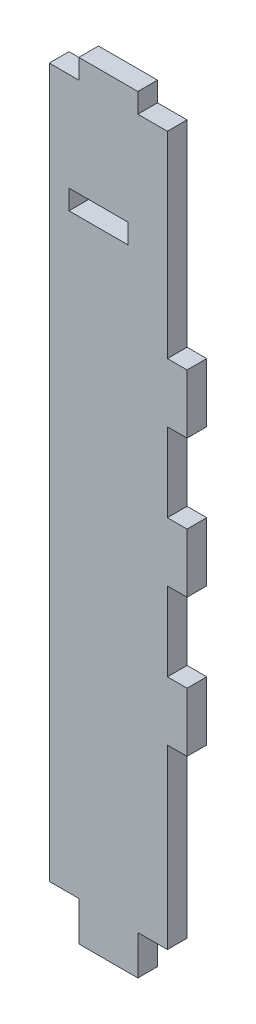
ISO-10303-21;
HEADER;
FILE_DESCRIPTION(('STEP AP214'),'2;1');
FILE_NAME('part.step','',(''),(''),'','','');
FILE_SCHEMA(('AUTOMOTIVE_DESIGN { 1 0 10303 214 1 1 1 1 }'));
ENDSEC;
DATA;
#1=APPLICATION_CONTEXT('core data for automotive mechanical design processes');
#2=APPLICATION_PROTOCOL_DEFINITION('international standard','automotive_design',2000,#1);
#3=PRODUCT_CONTEXT('',#1,'mechanical');
#4=PRODUCT('Part','Part','',(#3));
#5=PRODUCT_RELATED_PRODUCT_CATEGORY('part','',(#4));
#6=PRODUCT_DEFINITION_FORMATION('','',#4);
#7=PRODUCT_DEFINITION_CONTEXT('part definition',#1,'design');
#8=PRODUCT_DEFINITION('design','',#6,#7);
#9=PRODUCT_DEFINITION_SHAPE('','',#8);
#10=(LENGTH_UNIT() NAMED_UNIT(*) SI_UNIT(.MILLI.,.METRE.));
#11=(NAMED_UNIT(*) PLANE_ANGLE_UNIT() SI_UNIT($,.RADIAN.));
#12=(NAMED_UNIT(*) SI_UNIT($,.STERADIAN.) SOLID_ANGLE_UNIT());
#13=UNCERTAINTY_MEASURE_WITH_UNIT(LENGTH_MEASURE(1.E-05),#10,'distance_accuracy_value','');
#14=(GEOMETRIC_REPRESENTATION_CONTEXT(3) GLOBAL_UNCERTAINTY_ASSIGNED_CONTEXT((#13)) GLOBAL_UNIT_ASSIGNED_CONTEXT((#10,
#11,#12)) REPRESENTATION_CONTEXT('',''));
#15=CARTESIAN_POINT('',(0.,0.,0.));
#16=DIRECTION('',(0.,0.,1.));
#17=DIRECTION('',(1.,0.,0.));
#18=AXIS2_PLACEMENT_3D('',#15,#16,#17);
#19=CARTESIAN_POINT('',(405.,0.,-2.5));
#20=DIRECTION('',(-1.,0.,0.));
#21=DIRECTION('',(0.,0.,1.));
#22=AXIS2_PLACEMENT_3D('',#19,#20,#21);
#23=PLANE('',#22);
#24=DIRECTION('',(0.,-1.,0.));
#25=VECTOR('',#24,1.);
#26=CARTESIAN_POINT('',(405.,0.,2.5));
#27=LINE('',#26,#25);
#28=CARTESIAN_POINT('',(405.,410.000000000109,2.5));
#29=VERTEX_POINT('',#28);
#30=CARTESIAN_POINT('',(405.,405.000000000109,2.5));
#31=VERTEX_POINT('',#30);
#32=EDGE_CURVE('E316',#29,#31,#27,.T.);
#33=ORIENTED_EDGE('',*,*,#32,.T.);
#34=DIRECTION('',(0.,0.,1.));
#35=VECTOR('',#34,1.);
#36=CARTESIAN_POINT('',(405.,405.000000000109,-2.5));
#37=LINE('',#36,#35);
#38=CARTESIAN_POINT('',(405.,405.000000000109,-2.5));
#39=VERTEX_POINT('',#38);
#40=EDGE_CURVE('E11',#39,#31,#37,.T.);
#41=ORIENTED_EDGE('',*,*,#40,.F.);
#42=DIRECTION('',(0.,-1.,0.));
#43=VECTOR('',#42,1.);
#44=CARTESIAN_POINT('',(405.,0.,-2.5));
#45=LINE('',#44,#43);
#46=CARTESIAN_POINT('',(405.,410.000000000109,-2.5));
#47=VERTEX_POINT('',#46);
#48=EDGE_CURVE('E58',#47,#39,#45,.T.);
#49=ORIENTED_EDGE('',*,*,#48,.F.);
#50=DIRECTION('',(0.,0.,1.));
#51=VECTOR('',#50,1.);
#52=CARTESIAN_POINT('',(405.,410.000000000109,-2.5));
#53=LINE('',#52,#51);
#54=EDGE_CURVE('E239',#47,#29,#53,.T.);
#55=ORIENTED_EDGE('',*,*,#54,.T.);
#56=EDGE_LOOP('',(#33,#41,#49,#55));
#57=FACE_BOUND('',#56,.T.);
#58=ADVANCED_FACE('F39',(#57),#23,.F.);
#59=CARTESIAN_POINT('',(0.,405.000000000109,-2.5));
#60=DIRECTION('',(0.,1.,0.));
#61=DIRECTION('',(0.,0.,1.));
#62=AXIS2_PLACEMENT_3D('',#59,#60,#61);
#63=PLANE('',#62);
#64=DIRECTION('',(-1.,0.,0.));
#65=VECTOR('',#64,1.);
#66=CARTESIAN_POINT('',(0.,405.000000000109,2.5));
#67=LINE('',#66,#65);
#68=CARTESIAN_POINT('',(420.,405.000000000109,2.5));
#69=VERTEX_POINT('',#68);
#70=EDGE_CURVE('E321',#69,#31,#67,.T.);
#71=ORIENTED_EDGE('',*,*,#70,.F.);
#72=DIRECTION('',(0.,0.,1.));
#73=VECTOR('',#72,1.);
#74=CARTESIAN_POINT('',(420.,405.000000000109,-2.5));
#75=LINE('',#74,#73);
#76=CARTESIAN_POINT('',(420.,405.000000000109,-2.5));
#77=VERTEX_POINT('',#76);
#78=EDGE_CURVE('E49',#77,#69,#75,.T.);
#79=ORIENTED_EDGE('',*,*,#78,.F.);
#80=DIRECTION('',(-1.,0.,0.));
#81=VECTOR('',#80,1.);
#82=CARTESIAN_POINT('',(0.,405.000000000109,-2.5));
#83=LINE('',#82,#81);
#84=EDGE_CURVE('E247',#77,#39,#83,.T.);
#85=ORIENTED_EDGE('',*,*,#84,.T.);
#86=ORIENTED_EDGE('',*,*,#40,.T.);
#87=EDGE_LOOP('',(#71,#79,#85,#86));
#88=FACE_BOUND('',#87,.T.);
#89=ADVANCED_FACE('F403',(#88),#63,.T.);
#90=CARTESIAN_POINT('',(420.000000000005,4.66293670342571E-12,-2.5));
#91=DIRECTION('',(-1.,0.,0.));
#92=DIRECTION('',(0.,-1.,0.));
#93=AXIS2_PLACEMENT_3D('',#90,#91,#92);
#94=PLANE('',#93);
#95=DIRECTION('',(0.,-1.,0.));
#96=VECTOR('',#95,1.);
#97=CARTESIAN_POINT('',(420.000000000005,4.66293670342571E-12,2.5));
#98=LINE('',#97,#96);
#99=CARTESIAN_POINT('',(420.,410.000000000109,2.5));
#100=VERTEX_POINT('',#99);
#101=EDGE_CURVE('E236',#100,#69,#98,.T.);
#102=ORIENTED_EDGE('',*,*,#101,.F.);
#103=DIRECTION('',(0.,0.,1.));
#104=VECTOR('',#103,1.);
#105=CARTESIAN_POINT('',(420.,410.000000000109,-2.5));
#106=LINE('',#105,#104);
#107=CARTESIAN_POINT('',(420.,410.000000000109,-2.5));
#108=VERTEX_POINT('',#107);
#109=EDGE_CURVE('E231',#108,#100,#106,.T.);
#110=ORIENTED_EDGE('',*,*,#109,.F.);
#111=DIRECTION('',(0.,-1.,0.));
#112=VECTOR('',#111,1.);
#113=CARTESIAN_POINT('',(420.000000000005,4.66293670342571E-12,-2.5));
#114=LINE('',#113,#112);
#115=EDGE_CURVE('E235',#108,#77,#114,.T.);
#116=ORIENTED_EDGE('',*,*,#115,.T.);
#117=ORIENTED_EDGE('',*,*,#78,.T.);
#118=EDGE_LOOP('',(#102,#110,#116,#117));
#119=FACE_BOUND('',#118,.T.);
#120=ADVANCED_FACE('F233',(#119),#94,.T.);
#121=CARTESIAN_POINT('',(430.,0.,-2.5));
#122=DIRECTION('',(-1.,0.,0.));
#123=DIRECTION('',(0.,0.,1.));
#124=AXIS2_PLACEMENT_3D('',#121,#122,#123);
#125=PLANE('',#124);
#126=DIRECTION('',(0.,-1.,0.));
#127=VECTOR('',#126,1.);
#128=CARTESIAN_POINT('',(430.,0.,2.5));
#129=LINE('',#128,#127);
#130=CARTESIAN_POINT('',(430.,300.00000000011,2.5));
#131=VERTEX_POINT('',#130);
#132=CARTESIAN_POINT('',(430.,255.000000000111,2.5));
#133=VERTEX_POINT('',#132);
#134=EDGE_CURVE('E252',#131,#133,#129,.T.);
#135=ORIENTED_EDGE('',*,*,#134,.T.);
#136=DIRECTION('',(0.,0.,1.));
#137=VECTOR('',#136,1.);
#138=CARTESIAN_POINT('',(430.,255.000000000111,-2.5));
#139=LINE('',#138,#137);
#140=CARTESIAN_POINT('',(430.,255.000000000111,-2.5));
#141=VERTEX_POINT('',#140);
#142=EDGE_CURVE('E327',#141,#133,#139,.T.);
#143=ORIENTED_EDGE('',*,*,#142,.F.);
#144=DIRECTION('',(0.,-1.,0.));
#145=VECTOR('',#144,1.);
#146=CARTESIAN_POINT('',(430.,0.,-2.5));
#147=LINE('',#146,#145);
#148=CARTESIAN_POINT('',(430.,300.00000000011,-2.5));
#149=VERTEX_POINT('',#148);
#150=EDGE_CURVE('E323',#149,#141,#147,.T.);
#151=ORIENTED_EDGE('',*,*,#150,.F.);
#152=DIRECTION('',(0.,0.,1.));
#153=VECTOR('',#152,1.);
#154=CARTESIAN_POINT('',(430.,300.00000000011,-2.5));
#155=LINE('',#154,#153);
#156=EDGE_CURVE('E43',#149,#131,#155,.T.);
#157=ORIENTED_EDGE('',*,*,#156,.T.);
#158=EDGE_LOOP('',(#135,#143,#151,#157));
#159=FACE_BOUND('',#158,.T.);
#160=ADVANCED_FACE('F41',(#159),#125,.F.);
#161=CARTESIAN_POINT('',(0.,255.000000000111,-2.5));
#162=DIRECTION('',(0.,1.,0.));
#163=DIRECTION('',(0.,0.,1.));
#164=AXIS2_PLACEMENT_3D('',#161,#162,#163);
#165=PLANE('',#164);
#166=DIRECTION('',(-1.,0.,0.));
#167=VECTOR('',#166,1.);
#168=CARTESIAN_POINT('',(0.,255.000000000111,2.5));
#169=LINE('',#168,#167);
#170=CARTESIAN_POINT('',(422.5,255.000000000111,2.5));
#171=VERTEX_POINT('',#170);
#172=EDGE_CURVE('E314',#133,#171,#169,.T.);
#173=ORIENTED_EDGE('',*,*,#172,.T.);
#174=DIRECTION('',(0.,0.,1.));
#175=VECTOR('',#174,1.);
#176=CARTESIAN_POINT('',(422.5,255.000000000111,-2.5));
#177=LINE('',#176,#175);
#178=CARTESIAN_POINT('',(422.5,255.000000000111,-2.5));
#179=VERTEX_POINT('',#178);
#180=EDGE_CURVE('E330',#179,#171,#177,.T.);
#181=ORIENTED_EDGE('',*,*,#180,.F.);
#182=DIRECTION('',(-1.,0.,0.));
#183=VECTOR('',#182,1.);
#184=CARTESIAN_POINT('',(0.,255.000000000111,-2.5));
#185=LINE('',#184,#183);
#186=EDGE_CURVE('E557',#141,#179,#185,.T.);
#187=ORIENTED_EDGE('',*,*,#186,.F.);
#188=ORIENTED_EDGE('',*,*,#142,.T.);
#189=EDGE_LOOP('',(#173,#181,#187,#188));
#190=FACE_BOUND('',#189,.T.);
#191=ADVANCED_FACE('F412',(#190),#165,.F.);
#192=CARTESIAN_POINT('',(422.5,0.,-2.5));
#193=DIRECTION('',(-1.,0.,0.));
#194=DIRECTION('',(0.,0.,1.));
#195=AXIS2_PLACEMENT_3D('',#192,#193,#194);
#196=PLANE('',#195);
#197=DIRECTION('',(0.,-1.,0.));
#198=VECTOR('',#197,1.);
#199=CARTESIAN_POINT('',(422.5,0.,2.5));
#200=LINE('',#199,#198);
#201=CARTESIAN_POINT('',(422.5,245.000000000111,2.5));
#202=VERTEX_POINT('',#201);
#203=EDGE_CURVE('E312',#171,#202,#200,.T.);
#204=ORIENTED_EDGE('',*,*,#203,.T.);
#205=DIRECTION('',(0.,0.,1.));
#206=VECTOR('',#205,1.);
#207=CARTESIAN_POINT('',(422.5,245.000000000111,-2.5));
#208=LINE('',#207,#206);
#209=CARTESIAN_POINT('',(422.5,245.000000000111,-2.5));
#210=VERTEX_POINT('',#209);
#211=EDGE_CURVE('E333',#210,#202,#208,.T.);
#212=ORIENTED_EDGE('',*,*,#211,.F.);
#213=DIRECTION('',(0.,-1.,0.));
#214=VECTOR('',#213,1.);
#215=CARTESIAN_POINT('',(422.5,0.,-2.5));
#216=LINE('',#215,#214);
#217=EDGE_CURVE('E555',#179,#210,#216,.T.);
#218=ORIENTED_EDGE('',*,*,#217,.F.);
#219=ORIENTED_EDGE('',*,*,#180,.T.);
#220=EDGE_LOOP('',(#204,#212,#218,#219));
#221=FACE_BOUND('',#220,.T.);
#222=ADVANCED_FACE('F415',(#221),#196,.F.);
#223=CARTESIAN_POINT('',(0.,245.000000000111,-2.5));
#224=DIRECTION('',(0.,1.,0.));
#225=DIRECTION('',(0.,0.,1.));
#226=AXIS2_PLACEMENT_3D('',#223,#224,#225);
#227=PLANE('',#226);
#228=DIRECTION('',(-1.,0.,0.));
#229=VECTOR('',#228,1.);
#230=CARTESIAN_POINT('',(0.,245.000000000111,2.5));
#231=LINE('',#230,#229);
#232=CARTESIAN_POINT('',(407.5,245.000000000111,2.5));
#233=VERTEX_POINT('',#232);
#234=EDGE_CURVE('E309',#202,#233,#231,.T.);
#235=ORIENTED_EDGE('',*,*,#234,.T.);
#236=DIRECTION('',(0.,0.,1.));
#237=VECTOR('',#236,1.);
#238=CARTESIAN_POINT('',(407.5,245.000000000111,-2.5));
#239=LINE('',#238,#237);
#240=CARTESIAN_POINT('',(407.5,245.000000000111,-2.5));
#241=VERTEX_POINT('',#240);
#242=EDGE_CURVE('E336',#241,#233,#239,.T.);
#243=ORIENTED_EDGE('',*,*,#242,.F.);
#244=DIRECTION('',(-1.,0.,0.));
#245=VECTOR('',#244,1.);
#246=CARTESIAN_POINT('',(0.,245.000000000111,-2.5));
#247=LINE('',#246,#245);
#248=EDGE_CURVE('E553',#210,#241,#247,.T.);
#249=ORIENTED_EDGE('',*,*,#248,.F.);
#250=ORIENTED_EDGE('',*,*,#211,.T.);
#251=EDGE_LOOP('',(#235,#243,#249,#250));
#252=FACE_BOUND('',#251,.T.);
#253=ADVANCED_FACE('F419',(#252),#227,.F.);
#254=CARTESIAN_POINT('',(407.499999999965,-5.88140647295138E-11,-2.5));
#255=DIRECTION('',(-1.,1.44328993201273E-13,0.));
#256=DIRECTION('',(-1.44328993201273E-13,-1.,0.));
#257=AXIS2_PLACEMENT_3D('',#254,#255,#256);
#258=PLANE('',#257);
#259=DIRECTION('',(-1.44328993201273E-13,-1.,0.));
#260=VECTOR('',#259,1.);
#261=CARTESIAN_POINT('',(407.499999999965,-5.88140647295138E-11,2.5));
#262=LINE('',#261,#260);
#263=CARTESIAN_POINT('',(407.500000000002,255.000000000111,2.5));
#264=VERTEX_POINT('',#263);
#265=EDGE_CURVE('E306',#264,#233,#262,.T.);
#266=ORIENTED_EDGE('',*,*,#265,.F.);
#267=DIRECTION('',(0.,0.,1.));
#268=VECTOR('',#267,1.);
#269=CARTESIAN_POINT('',(407.500000000002,255.000000000111,-2.5));
#270=LINE('',#269,#268);
#271=CARTESIAN_POINT('',(407.500000000002,255.000000000111,-2.5));
#272=VERTEX_POINT('',#271);
#273=EDGE_CURVE('E338',#272,#264,#270,.T.);
#274=ORIENTED_EDGE('',*,*,#273,.F.);
#275=DIRECTION('',(-1.44328993201273E-13,-1.,0.));
#276=VECTOR('',#275,1.);
#277=CARTESIAN_POINT('',(407.499999999965,-5.88140647295138E-11,-2.5));
#278=LINE('',#277,#276);
#279=EDGE_CURVE('E550',#272,#241,#278,.T.);
#280=ORIENTED_EDGE('',*,*,#279,.T.);
#281=ORIENTED_EDGE('',*,*,#242,.T.);
#282=EDGE_LOOP('',(#266,#274,#280,#281));
#283=FACE_BOUND('',#282,.T.);
#284=ADVANCED_FACE('F423',(#283),#258,.T.);
#285=CARTESIAN_POINT('',(0.,255.000000000111,-2.5));
#286=DIRECTION('',(0.,1.,0.));
#287=DIRECTION('',(0.,0.,1.));
#288=AXIS2_PLACEMENT_3D('',#285,#286,#287);
#289=PLANE('',#288);
#290=DIRECTION('',(-1.,0.,0.));
#291=VECTOR('',#290,1.);
#292=CARTESIAN_POINT('',(0.,255.000000000111,2.5));
#293=LINE('',#292,#291);
#294=CARTESIAN_POINT('',(400.,255.000000000111,2.5));
#295=VERTEX_POINT('',#294);
#296=EDGE_CURVE('E303',#264,#295,#293,.T.);
#297=ORIENTED_EDGE('',*,*,#296,.T.);
#298=DIRECTION('',(0.,0.,1.));
#299=VECTOR('',#298,1.);
#300=CARTESIAN_POINT('',(400.,255.000000000111,-2.5));
#301=LINE('',#300,#299);
#302=CARTESIAN_POINT('',(400.,255.000000000111,-2.5));
#303=VERTEX_POINT('',#302);
#304=EDGE_CURVE('E340',#303,#295,#301,.T.);
#305=ORIENTED_EDGE('',*,*,#304,.F.);
#306=DIRECTION('',(-1.,0.,0.));
#307=VECTOR('',#306,1.);
#308=CARTESIAN_POINT('',(0.,255.000000000111,-2.5));
#309=LINE('',#308,#307);
#310=EDGE_CURVE('E548',#272,#303,#309,.T.);
#311=ORIENTED_EDGE('',*,*,#310,.F.);
#312=ORIENTED_EDGE('',*,*,#273,.T.);
#313=EDGE_LOOP('',(#297,#305,#311,#312));
#314=FACE_BOUND('',#313,.T.);
#315=ADVANCED_FACE('F427',(#314),#289,.F.);
#316=CARTESIAN_POINT('',(400.,0.,-2.5));
#317=DIRECTION('',(-1.,0.,0.));
#318=DIRECTION('',(0.,0.,1.));
#319=AXIS2_PLACEMENT_3D('',#316,#317,#318);
#320=PLANE('',#319);
#321=DIRECTION('',(0.,-1.,0.));
#322=VECTOR('',#321,1.);
#323=CARTESIAN_POINT('',(400.,0.,2.5));
#324=LINE('',#323,#322);
#325=CARTESIAN_POINT('',(400.,435.000000000109,2.5));
#326=VERTEX_POINT('',#325);
#327=EDGE_CURVE('E300',#326,#295,#324,.T.);
#328=ORIENTED_EDGE('',*,*,#327,.F.);
#329=DIRECTION('',(0.,0.,1.));
#330=VECTOR('',#329,1.);
#331=CARTESIAN_POINT('',(400.,435.000000000109,-2.5));
#332=LINE('',#331,#330);
#333=CARTESIAN_POINT('',(400.,435.000000000109,-2.5));
#334=VERTEX_POINT('',#333);
#335=EDGE_CURVE('E342',#334,#326,#332,.T.);
#336=ORIENTED_EDGE('',*,*,#335,.F.);
#337=DIRECTION('',(0.,-1.,0.));
#338=VECTOR('',#337,1.);
#339=CARTESIAN_POINT('',(400.,0.,-2.5));
#340=LINE('',#339,#338);
#341=EDGE_CURVE('E545',#334,#303,#340,.T.);
#342=ORIENTED_EDGE('',*,*,#341,.T.);
#343=ORIENTED_EDGE('',*,*,#304,.T.);
#344=EDGE_LOOP('',(#328,#336,#342,#343));
#345=FACE_BOUND('',#344,.T.);
#346=ADVANCED_FACE('F431',(#345),#320,.T.);
#347=CARTESIAN_POINT('',(0.,435.000000000109,-2.5));
#348=DIRECTION('',(0.,1.,0.));
#349=DIRECTION('',(0.,0.,1.));
#350=AXIS2_PLACEMENT_3D('',#347,#348,#349);
#351=PLANE('',#350);
#352=DIRECTION('',(-1.,0.,0.));
#353=VECTOR('',#352,1.);
#354=CARTESIAN_POINT('',(0.,435.000000000109,2.5));
#355=LINE('',#354,#353);
#356=CARTESIAN_POINT('',(407.5,435.000000000109,2.5));
#357=VERTEX_POINT('',#356);
#358=EDGE_CURVE('E297',#357,#326,#355,.T.);
#359=ORIENTED_EDGE('',*,*,#358,.F.);
#360=DIRECTION('',(0.,0.,1.));
#361=VECTOR('',#360,1.);
#362=CARTESIAN_POINT('',(407.5,435.000000000109,-2.5));
#363=LINE('',#362,#361);
#364=CARTESIAN_POINT('',(407.5,435.000000000109,-2.5));
#365=VERTEX_POINT('',#364);
#366=EDGE_CURVE('E344',#365,#357,#363,.T.);
#367=ORIENTED_EDGE('',*,*,#366,.F.);
#368=DIRECTION('',(-1.,0.,0.));
#369=VECTOR('',#368,1.);
#370=CARTESIAN_POINT('',(0.,435.000000000109,-2.5));
#371=LINE('',#370,#369);
#372=EDGE_CURVE('E542',#365,#334,#371,.T.);
#373=ORIENTED_EDGE('',*,*,#372,.T.);
#374=ORIENTED_EDGE('',*,*,#335,.T.);
#375=EDGE_LOOP('',(#359,#367,#373,#374));
#376=FACE_BOUND('',#375,.T.);
#377=ADVANCED_FACE('F435',(#376),#351,.T.);
#378=CARTESIAN_POINT('',(407.5,0.,-2.5));
#379=DIRECTION('',(1.,0.,0.));
#380=DIRECTION('',(0.,0.,-1.));
#381=AXIS2_PLACEMENT_3D('',#378,#379,#380);
#382=PLANE('',#381);
#383=DIRECTION('',(0.,1.,0.));
#384=VECTOR('',#383,1.);
#385=CARTESIAN_POINT('',(407.5,0.,2.5));
#386=LINE('',#385,#384);
#387=CARTESIAN_POINT('',(407.5,440.000000000109,2.5));
#388=VERTEX_POINT('',#387);
#389=EDGE_CURVE('E294',#357,#388,#386,.T.);
#390=ORIENTED_EDGE('',*,*,#389,.T.);
#391=DIRECTION('',(0.,0.,1.));
#392=VECTOR('',#391,1.);
#393=CARTESIAN_POINT('',(407.5,440.000000000109,-2.5));
#394=LINE('',#393,#392);
#395=CARTESIAN_POINT('',(407.5,440.000000000109,-2.5));
#396=VERTEX_POINT('',#395);
#397=EDGE_CURVE('E346',#396,#388,#394,.T.);
#398=ORIENTED_EDGE('',*,*,#397,.F.);
#399=DIRECTION('',(0.,1.,0.));
#400=VECTOR('',#399,1.);
#401=CARTESIAN_POINT('',(407.5,0.,-2.5));
#402=LINE('',#401,#400);
#403=EDGE_CURVE('E540',#365,#396,#402,.T.);
#404=ORIENTED_EDGE('',*,*,#403,.F.);
#405=ORIENTED_EDGE('',*,*,#366,.T.);
#406=EDGE_LOOP('',(#390,#398,#404,#405));
#407=FACE_BOUND('',#406,.T.);
#408=ADVANCED_FACE('F439',(#407),#382,.F.);
#409=CARTESIAN_POINT('',(0.,440.000000000109,-2.5));
#410=DIRECTION('',(0.,1.,0.));
#411=DIRECTION('',(0.,0.,1.));
#412=AXIS2_PLACEMENT_3D('',#409,#410,#411);
#413=PLANE('',#412);
#414=DIRECTION('',(-1.,0.,0.));
#415=VECTOR('',#414,1.);
#416=CARTESIAN_POINT('',(0.,440.000000000109,2.5));
#417=LINE('',#416,#415);
#418=CARTESIAN_POINT('',(422.5,440.000000000109,2.5));
#419=VERTEX_POINT('',#418);
#420=EDGE_CURVE('E291',#419,#388,#417,.T.);
#421=ORIENTED_EDGE('',*,*,#420,.F.);
#422=DIRECTION('',(0.,0.,1.));
#423=VECTOR('',#422,1.);
#424=CARTESIAN_POINT('',(422.5,440.000000000109,-2.5));
#425=LINE('',#424,#423);
#426=CARTESIAN_POINT('',(422.5,440.000000000109,-2.5));
#427=VERTEX_POINT('',#426);
#428=EDGE_CURVE('E348',#427,#419,#425,.T.);
#429=ORIENTED_EDGE('',*,*,#428,.F.);
#430=DIRECTION('',(-1.,0.,0.));
#431=VECTOR('',#430,1.);
#432=CARTESIAN_POINT('',(0.,440.000000000109,-2.5));
#433=LINE('',#432,#431);
#434=EDGE_CURVE('E537',#427,#396,#433,.T.);
#435=ORIENTED_EDGE('',*,*,#434,.T.);
#436=ORIENTED_EDGE('',*,*,#397,.T.);
#437=EDGE_LOOP('',(#421,#429,#435,#436));
#438=FACE_BOUND('',#437,.T.);
#439=ADVANCED_FACE('F443',(#438),#413,.T.);
#440=CARTESIAN_POINT('',(422.5,0.,-2.5));
#441=DIRECTION('',(1.,0.,0.));
#442=DIRECTION('',(0.,0.,-1.));
#443=AXIS2_PLACEMENT_3D('',#440,#441,#442);
#444=PLANE('',#443);
#445=DIRECTION('',(0.,1.,0.));
#446=VECTOR('',#445,1.);
#447=CARTESIAN_POINT('',(422.5,0.,2.5));
#448=LINE('',#447,#446);
#449=CARTESIAN_POINT('',(422.5,435.000000000109,2.5));
#450=VERTEX_POINT('',#449);
#451=EDGE_CURVE('E288',#450,#419,#448,.T.);
#452=ORIENTED_EDGE('',*,*,#451,.F.);
#453=DIRECTION('',(0.,0.,1.));
#454=VECTOR('',#453,1.);
#455=CARTESIAN_POINT('',(422.5,435.000000000109,-2.5));
#456=LINE('',#455,#454);
#457=CARTESIAN_POINT('',(422.5,435.000000000109,-2.5));
#458=VERTEX_POINT('',#457);
#459=EDGE_CURVE('E350',#458,#450,#456,.T.);
#460=ORIENTED_EDGE('',*,*,#459,.F.);
#461=DIRECTION('',(0.,1.,0.));
#462=VECTOR('',#461,1.);
#463=CARTESIAN_POINT('',(422.5,0.,-2.5));
#464=LINE('',#463,#462);
#465=EDGE_CURVE('E534',#458,#427,#464,.T.);
#466=ORIENTED_EDGE('',*,*,#465,.T.);
#467=ORIENTED_EDGE('',*,*,#428,.T.);
#468=EDGE_LOOP('',(#452,#460,#466,#467));
#469=FACE_BOUND('',#468,.T.);
#470=ADVANCED_FACE('F447',(#469),#444,.T.);
#471=CARTESIAN_POINT('',(0.,435.000000000109,-2.5));
#472=DIRECTION('',(0.,1.,0.));
#473=DIRECTION('',(0.,0.,1.));
#474=AXIS2_PLACEMENT_3D('',#471,#472,#473);
#475=PLANE('',#474);
#476=DIRECTION('',(-1.,0.,0.));
#477=VECTOR('',#476,1.);
#478=CARTESIAN_POINT('',(0.,435.000000000109,2.5));
#479=LINE('',#478,#477);
#480=CARTESIAN_POINT('',(430.,435.000000000109,2.5));
#481=VERTEX_POINT('',#480);
#482=EDGE_CURVE('E285',#481,#450,#479,.T.);
#483=ORIENTED_EDGE('',*,*,#482,.F.);
#484=DIRECTION('',(0.,0.,1.));
#485=VECTOR('',#484,1.);
#486=CARTESIAN_POINT('',(430.,435.000000000109,-2.5));
#487=LINE('',#486,#485);
#488=CARTESIAN_POINT('',(430.,435.000000000109,-2.5));
#489=VERTEX_POINT('',#488);
#490=EDGE_CURVE('E352',#489,#481,#487,.T.);
#491=ORIENTED_EDGE('',*,*,#490,.F.);
#492=DIRECTION('',(-1.,0.,0.));
#493=VECTOR('',#492,1.);
#494=CARTESIAN_POINT('',(0.,435.000000000109,-2.5));
#495=LINE('',#494,#493);
#496=EDGE_CURVE('E531',#489,#458,#495,.T.);
#497=ORIENTED_EDGE('',*,*,#496,.T.);
#498=ORIENTED_EDGE('',*,*,#459,.T.);
#499=EDGE_LOOP('',(#483,#491,#497,#498));
#500=FACE_BOUND('',#499,.T.);
#501=ADVANCED_FACE('F451',(#500),#475,.T.);
#502=CARTESIAN_POINT('',(430.,0.,-2.5));
#503=DIRECTION('',(-1.,0.,0.));
#504=DIRECTION('',(0.,0.,1.));
#505=AXIS2_PLACEMENT_3D('',#502,#503,#504);
#506=PLANE('',#505);
#507=DIRECTION('',(0.,-1.,0.));
#508=VECTOR('',#507,1.);
#509=CARTESIAN_POINT('',(430.,0.,2.5));
#510=LINE('',#509,#508);
#511=CARTESIAN_POINT('',(430.,385.00000000011,2.5));
#512=VERTEX_POINT('',#511);
#513=EDGE_CURVE('E283',#481,#512,#510,.T.);
#514=ORIENTED_EDGE('',*,*,#513,.T.);
#515=DIRECTION('',(0.,0.,1.));
#516=VECTOR('',#515,1.);
#517=CARTESIAN_POINT('',(430.,385.00000000011,-2.5));
#518=LINE('',#517,#516);
#519=CARTESIAN_POINT('',(430.,385.00000000011,-2.5));
#520=VERTEX_POINT('',#519);
#521=EDGE_CURVE('E354',#520,#512,#518,.T.);
#522=ORIENTED_EDGE('',*,*,#521,.F.);
#523=DIRECTION('',(0.,-1.,0.));
#524=VECTOR('',#523,1.);
#525=CARTESIAN_POINT('',(430.,0.,-2.5));
#526=LINE('',#525,#524);
#527=EDGE_CURVE('E529',#489,#520,#526,.T.);
#528=ORIENTED_EDGE('',*,*,#527,.F.);
#529=ORIENTED_EDGE('',*,*,#490,.T.);
#530=EDGE_LOOP('',(#514,#522,#528,#529));
#531=FACE_BOUND('',#530,.T.);
#532=ADVANCED_FACE('F455',(#531),#506,.F.);
#533=CARTESIAN_POINT('',(0.,385.00000000011,-2.5));
#534=DIRECTION('',(0.,-1.,0.));
#535=DIRECTION('',(0.,0.,-1.));
#536=AXIS2_PLACEMENT_3D('',#533,#534,#535);
#537=PLANE('',#536);
#538=DIRECTION('',(1.,0.,0.));
#539=VECTOR('',#538,1.);
#540=CARTESIAN_POINT('',(0.,385.00000000011,2.5));
#541=LINE('',#540,#539);
#542=CARTESIAN_POINT('',(435.,385.00000000011,2.5));
#543=VERTEX_POINT('',#542);
#544=EDGE_CURVE('E281',#512,#543,#541,.T.);
#545=ORIENTED_EDGE('',*,*,#544,.T.);
#546=DIRECTION('',(0.,0.,1.));
#547=VECTOR('',#546,1.);
#548=CARTESIAN_POINT('',(435.,385.00000000011,-2.5));
#549=LINE('',#548,#547);
#550=CARTESIAN_POINT('',(435.,385.00000000011,-2.5));
#551=VERTEX_POINT('',#550);
#552=EDGE_CURVE('E357',#551,#543,#549,.T.);
#553=ORIENTED_EDGE('',*,*,#552,.F.);
#554=DIRECTION('',(1.,0.,0.));
#555=VECTOR('',#554,1.);
#556=CARTESIAN_POINT('',(0.,385.00000000011,-2.5));
#557=LINE('',#556,#555);
#558=EDGE_CURVE('E527',#520,#551,#557,.T.);
#559=ORIENTED_EDGE('',*,*,#558,.F.);
#560=ORIENTED_EDGE('',*,*,#521,.T.);
#561=EDGE_LOOP('',(#545,#553,#559,#560));
#562=FACE_BOUND('',#561,.T.);
#563=ADVANCED_FACE('F459',(#562),#537,.F.);
#564=CARTESIAN_POINT('',(435.,0.,-2.5));
#565=DIRECTION('',(-1.,0.,0.));
#566=DIRECTION('',(0.,0.,1.));
#567=AXIS2_PLACEMENT_3D('',#564,#565,#566);
#568=PLANE('',#567);
#569=DIRECTION('',(0.,-1.,0.));
#570=VECTOR('',#569,1.);
#571=CARTESIAN_POINT('',(435.,0.,2.5));
#572=LINE('',#571,#570);
#573=CARTESIAN_POINT('',(435.,370.00000000011,2.5));
#574=VERTEX_POINT('',#573);
#575=EDGE_CURVE('E278',#543,#574,#572,.T.);
#576=ORIENTED_EDGE('',*,*,#575,.T.);
#577=DIRECTION('',(0.,0.,1.));
#578=VECTOR('',#577,1.);
#579=CARTESIAN_POINT('',(435.,370.00000000011,-2.5));
#580=LINE('',#579,#578);
#581=CARTESIAN_POINT('',(435.,370.00000000011,-2.5));
#582=VERTEX_POINT('',#581);
#583=EDGE_CURVE('E360',#582,#574,#580,.T.);
#584=ORIENTED_EDGE('',*,*,#583,.F.);
#585=DIRECTION('',(0.,-1.,0.));
#586=VECTOR('',#585,1.);
#587=CARTESIAN_POINT('',(435.,0.,-2.5));
#588=LINE('',#587,#586);
#589=EDGE_CURVE('E525',#551,#582,#588,.T.);
#590=ORIENTED_EDGE('',*,*,#589,.F.);
#591=ORIENTED_EDGE('',*,*,#552,.T.);
#592=EDGE_LOOP('',(#576,#584,#590,#591));
#593=FACE_BOUND('',#592,.T.);
#594=ADVANCED_FACE('F463',(#593),#568,.F.);
#595=CARTESIAN_POINT('',(0.,370.00000000011,-2.5));
#596=DIRECTION('',(0.,-1.,0.));
#597=DIRECTION('',(0.,0.,-1.));
#598=AXIS2_PLACEMENT_3D('',#595,#596,#597);
#599=PLANE('',#598);
#600=DIRECTION('',(1.,0.,0.));
#601=VECTOR('',#600,1.);
#602=CARTESIAN_POINT('',(0.,370.00000000011,2.5));
#603=LINE('',#602,#601);
#604=CARTESIAN_POINT('',(430.,370.00000000011,2.5));
#605=VERTEX_POINT('',#604);
#606=EDGE_CURVE('E275',#605,#574,#603,.T.);
#607=ORIENTED_EDGE('',*,*,#606,.F.);
#608=DIRECTION('',(0.,0.,1.));
#609=VECTOR('',#608,1.);
#610=CARTESIAN_POINT('',(430.,370.00000000011,-2.5));
#611=LINE('',#610,#609);
#612=CARTESIAN_POINT('',(430.,370.00000000011,-2.5));
#613=VERTEX_POINT('',#612);
#614=EDGE_CURVE('E362',#613,#605,#611,.T.);
#615=ORIENTED_EDGE('',*,*,#614,.F.);
#616=DIRECTION('',(1.,0.,0.));
#617=VECTOR('',#616,1.);
#618=CARTESIAN_POINT('',(0.,370.00000000011,-2.5));
#619=LINE('',#618,#617);
#620=EDGE_CURVE('E522',#613,#582,#619,.T.);
#621=ORIENTED_EDGE('',*,*,#620,.T.);
#622=ORIENTED_EDGE('',*,*,#583,.T.);
#623=EDGE_LOOP('',(#607,#615,#621,#622));
#624=FACE_BOUND('',#623,.T.);
#625=ADVANCED_FACE('F467',(#624),#599,.T.);
#626=CARTESIAN_POINT('',(430.,0.,-2.5));
#627=DIRECTION('',(-1.,0.,0.));
#628=DIRECTION('',(0.,0.,1.));
#629=AXIS2_PLACEMENT_3D('',#626,#627,#628);
#630=PLANE('',#629);
#631=DIRECTION('',(0.,-1.,0.));
#632=VECTOR('',#631,1.);
#633=CARTESIAN_POINT('',(430.,0.,2.5));
#634=LINE('',#633,#632);
#635=CARTESIAN_POINT('',(430.,350.00000000011,2.5));
#636=VERTEX_POINT('',#635);
#637=EDGE_CURVE('E273',#605,#636,#634,.T.);
#638=ORIENTED_EDGE('',*,*,#637,.T.);
#639=DIRECTION('',(0.,0.,1.));
#640=VECTOR('',#639,1.);
#641=CARTESIAN_POINT('',(430.,350.00000000011,-2.5));
#642=LINE('',#641,#640);
#643=CARTESIAN_POINT('',(430.,350.00000000011,-2.5));
#644=VERTEX_POINT('',#643);
#645=EDGE_CURVE('E364',#644,#636,#642,.T.);
#646=ORIENTED_EDGE('',*,*,#645,.F.);
#647=DIRECTION('',(0.,-1.,0.));
#648=VECTOR('',#647,1.);
#649=CARTESIAN_POINT('',(430.,0.,-2.5));
#650=LINE('',#649,#648);
#651=EDGE_CURVE('E520',#613,#644,#650,.T.);
#652=ORIENTED_EDGE('',*,*,#651,.F.);
#653=ORIENTED_EDGE('',*,*,#614,.T.);
#654=EDGE_LOOP('',(#638,#646,#652,#653));
#655=FACE_BOUND('',#654,.T.);
#656=ADVANCED_FACE('F471',(#655),#630,.F.);
#657=CARTESIAN_POINT('',(0.,350.00000000011,-2.5));
#658=DIRECTION('',(0.,-1.,0.));
#659=DIRECTION('',(0.,0.,-1.));
#660=AXIS2_PLACEMENT_3D('',#657,#658,#659);
#661=PLANE('',#660);
#662=DIRECTION('',(1.,0.,0.));
#663=VECTOR('',#662,1.);
#664=CARTESIAN_POINT('',(0.,350.00000000011,2.5));
#665=LINE('',#664,#663);
#666=CARTESIAN_POINT('',(435.,350.00000000011,2.5));
#667=VERTEX_POINT('',#666);
#668=EDGE_CURVE('E271',#636,#667,#665,.T.);
#669=ORIENTED_EDGE('',*,*,#668,.T.);
#670=DIRECTION('',(0.,0.,1.));
#671=VECTOR('',#670,1.);
#672=CARTESIAN_POINT('',(435.,350.00000000011,-2.5));
#673=LINE('',#672,#671);
#674=CARTESIAN_POINT('',(435.,350.00000000011,-2.5));
#675=VERTEX_POINT('',#674);
#676=EDGE_CURVE('E367',#675,#667,#673,.T.);
#677=ORIENTED_EDGE('',*,*,#676,.F.);
#678=DIRECTION('',(1.,0.,0.));
#679=VECTOR('',#678,1.);
#680=CARTESIAN_POINT('',(0.,350.00000000011,-2.5));
#681=LINE('',#680,#679);
#682=EDGE_CURVE('E518',#644,#675,#681,.T.);
#683=ORIENTED_EDGE('',*,*,#682,.F.);
#684=ORIENTED_EDGE('',*,*,#645,.T.);
#685=EDGE_LOOP('',(#669,#677,#683,#684));
#686=FACE_BOUND('',#685,.T.);
#687=ADVANCED_FACE('F475',(#686),#661,.F.);
#688=CARTESIAN_POINT('',(435.,0.,-2.5));
#689=DIRECTION('',(-1.,0.,0.));
#690=DIRECTION('',(0.,0.,1.));
#691=AXIS2_PLACEMENT_3D('',#688,#689,#690);
#692=PLANE('',#691);
#693=DIRECTION('',(0.,-1.,0.));
#694=VECTOR('',#693,1.);
#695=CARTESIAN_POINT('',(435.,0.,2.5));
#696=LINE('',#695,#694);
#697=CARTESIAN_POINT('',(435.,335.00000000011,2.5));
#698=VERTEX_POINT('',#697);
#699=EDGE_CURVE('E268',#667,#698,#696,.T.);
#700=ORIENTED_EDGE('',*,*,#699,.T.);
#701=DIRECTION('',(0.,0.,1.));
#702=VECTOR('',#701,1.);
#703=CARTESIAN_POINT('',(435.,335.00000000011,-2.5));
#704=LINE('',#703,#702);
#705=CARTESIAN_POINT('',(435.,335.00000000011,-2.5));
#706=VERTEX_POINT('',#705);
#707=EDGE_CURVE('E370',#706,#698,#704,.T.);
#708=ORIENTED_EDGE('',*,*,#707,.F.);
#709=DIRECTION('',(0.,-1.,0.));
#710=VECTOR('',#709,1.);
#711=CARTESIAN_POINT('',(435.,0.,-2.5));
#712=LINE('',#711,#710);
#713=EDGE_CURVE('E516',#675,#706,#712,.T.);
#714=ORIENTED_EDGE('',*,*,#713,.F.);
#715=ORIENTED_EDGE('',*,*,#676,.T.);
#716=EDGE_LOOP('',(#700,#708,#714,#715));
#717=FACE_BOUND('',#716,.T.);
#718=ADVANCED_FACE('F479',(#717),#692,.F.);
#719=CARTESIAN_POINT('',(0.,335.00000000011,-2.5));
#720=DIRECTION('',(0.,-1.,0.));
#721=DIRECTION('',(0.,0.,-1.));
#722=AXIS2_PLACEMENT_3D('',#719,#720,#721);
#723=PLANE('',#722);
#724=DIRECTION('',(1.,0.,0.));
#725=VECTOR('',#724,1.);
#726=CARTESIAN_POINT('',(0.,335.00000000011,2.5));
#727=LINE('',#726,#725);
#728=CARTESIAN_POINT('',(430.,335.00000000011,2.5));
#729=VERTEX_POINT('',#728);
#730=EDGE_CURVE('E265',#729,#698,#727,.T.);
#731=ORIENTED_EDGE('',*,*,#730,.F.);
#732=DIRECTION('',(0.,0.,1.));
#733=VECTOR('',#732,1.);
#734=CARTESIAN_POINT('',(430.,335.00000000011,-2.5));
#735=LINE('',#734,#733);
#736=CARTESIAN_POINT('',(430.,335.00000000011,-2.5));
#737=VERTEX_POINT('',#736);
#738=EDGE_CURVE('E372',#737,#729,#735,.T.);
#739=ORIENTED_EDGE('',*,*,#738,.F.);
#740=DIRECTION('',(1.,0.,0.));
#741=VECTOR('',#740,1.);
#742=CARTESIAN_POINT('',(0.,335.00000000011,-2.5));
#743=LINE('',#742,#741);
#744=EDGE_CURVE('E513',#737,#706,#743,.T.);
#745=ORIENTED_EDGE('',*,*,#744,.T.);
#746=ORIENTED_EDGE('',*,*,#707,.T.);
#747=EDGE_LOOP('',(#731,#739,#745,#746));
#748=FACE_BOUND('',#747,.T.);
#749=ADVANCED_FACE('F483',(#748),#723,.T.);
#750=CARTESIAN_POINT('',(430.,0.,-2.5));
#751=DIRECTION('',(-1.,0.,0.));
#752=DIRECTION('',(0.,0.,1.));
#753=AXIS2_PLACEMENT_3D('',#750,#751,#752);
#754=PLANE('',#753);
#755=DIRECTION('',(0.,-1.,0.));
#756=VECTOR('',#755,1.);
#757=CARTESIAN_POINT('',(430.,0.,2.5));
#758=LINE('',#757,#756);
#759=CARTESIAN_POINT('',(430.,315.00000000011,2.5));
#760=VERTEX_POINT('',#759);
#761=EDGE_CURVE('E263',#729,#760,#758,.T.);
#762=ORIENTED_EDGE('',*,*,#761,.T.);
#763=DIRECTION('',(0.,0.,1.));
#764=VECTOR('',#763,1.);
#765=CARTESIAN_POINT('',(430.,315.00000000011,-2.5));
#766=LINE('',#765,#764);
#767=CARTESIAN_POINT('',(430.,315.00000000011,-2.5));
#768=VERTEX_POINT('',#767);
#769=EDGE_CURVE('E374',#768,#760,#766,.T.);
#770=ORIENTED_EDGE('',*,*,#769,.F.);
#771=DIRECTION('',(0.,-1.,0.));
#772=VECTOR('',#771,1.);
#773=CARTESIAN_POINT('',(430.,0.,-2.5));
#774=LINE('',#773,#772);
#775=EDGE_CURVE('E507',#737,#768,#774,.T.);
#776=ORIENTED_EDGE('',*,*,#775,.F.);
#777=ORIENTED_EDGE('',*,*,#738,.T.);
#778=EDGE_LOOP('',(#762,#770,#776,#777));
#779=FACE_BOUND('',#778,.T.);
#780=ADVANCED_FACE('F487',(#779),#754,.F.);
#781=CARTESIAN_POINT('',(0.,315.00000000011,-2.5));
#782=DIRECTION('',(0.,-1.,0.));
#783=DIRECTION('',(0.,0.,-1.));
#784=AXIS2_PLACEMENT_3D('',#781,#782,#783);
#785=PLANE('',#784);
#786=DIRECTION('',(1.,0.,0.));
#787=VECTOR('',#786,1.);
#788=CARTESIAN_POINT('',(0.,315.00000000011,2.5));
#789=LINE('',#788,#787);
#790=CARTESIAN_POINT('',(435.,315.00000000011,2.5));
#791=VERTEX_POINT('',#790);
#792=EDGE_CURVE('E261',#760,#791,#789,.T.);
#793=ORIENTED_EDGE('',*,*,#792,.T.);
#794=DIRECTION('',(0.,0.,1.));
#795=VECTOR('',#794,1.);
#796=CARTESIAN_POINT('',(435.,315.00000000011,-2.5));
#797=LINE('',#796,#795);
#798=CARTESIAN_POINT('',(435.,315.00000000011,-2.5));
#799=VERTEX_POINT('',#798);
#800=EDGE_CURVE('E377',#799,#791,#797,.T.);
#801=ORIENTED_EDGE('',*,*,#800,.F.);
#802=DIRECTION('',(1.,0.,0.));
#803=VECTOR('',#802,1.);
#804=CARTESIAN_POINT('',(0.,315.00000000011,-2.5));
#805=LINE('',#804,#803);
#806=EDGE_CURVE('E504',#768,#799,#805,.T.);
#807=ORIENTED_EDGE('',*,*,#806,.F.);
#808=ORIENTED_EDGE('',*,*,#769,.T.);
#809=EDGE_LOOP('',(#793,#801,#807,#808));
#810=FACE_BOUND('',#809,.T.);
#811=ADVANCED_FACE('F399',(#810),#785,.F.);
#812=CARTESIAN_POINT('',(435.,0.,-2.5));
#813=DIRECTION('',(-1.,0.,0.));
#814=DIRECTION('',(0.,0.,1.));
#815=AXIS2_PLACEMENT_3D('',#812,#813,#814);
#816=PLANE('',#815);
#817=DIRECTION('',(0.,-1.,0.));
#818=VECTOR('',#817,1.);
#819=CARTESIAN_POINT('',(435.,0.,2.5));
#820=LINE('',#819,#818);
#821=CARTESIAN_POINT('',(435.,300.00000000011,2.5));
#822=VERTEX_POINT('',#821);
#823=EDGE_CURVE('E258',#791,#822,#820,.T.);
#824=ORIENTED_EDGE('',*,*,#823,.T.);
#825=DIRECTION('',(0.,0.,1.));
#826=VECTOR('',#825,1.);
#827=CARTESIAN_POINT('',(435.,300.00000000011,-2.5));
#828=LINE('',#827,#826);
#829=CARTESIAN_POINT('',(435.,300.00000000011,-2.5));
#830=VERTEX_POINT('',#829);
#831=EDGE_CURVE('E379',#830,#822,#828,.T.);
#832=ORIENTED_EDGE('',*,*,#831,.F.);
#833=DIRECTION('',(0.,-1.,0.));
#834=VECTOR('',#833,1.);
#835=CARTESIAN_POINT('',(435.,0.,-2.5));
#836=LINE('',#835,#834);
#837=EDGE_CURVE('E502',#799,#830,#836,.T.);
#838=ORIENTED_EDGE('',*,*,#837,.F.);
#839=ORIENTED_EDGE('',*,*,#800,.T.);
#840=EDGE_LOOP('',(#824,#832,#838,#839));
#841=FACE_BOUND('',#840,.T.);
#842=ADVANCED_FACE('F393',(#841),#816,.F.);
#843=CARTESIAN_POINT('',(0.,300.00000000011,-2.5));
#844=DIRECTION('',(0.,-1.,0.));
#845=DIRECTION('',(0.,0.,-1.));
#846=AXIS2_PLACEMENT_3D('',#843,#844,#845);
#847=PLANE('',#846);
#848=DIRECTION('',(1.,0.,0.));
#849=VECTOR('',#848,1.);
#850=CARTESIAN_POINT('',(0.,300.00000000011,2.5));
#851=LINE('',#850,#849);
#852=EDGE_CURVE('E255',#131,#822,#851,.T.);
#853=ORIENTED_EDGE('',*,*,#852,.F.);
#854=ORIENTED_EDGE('',*,*,#156,.F.);
#855=DIRECTION('',(1.,0.,0.));
#856=VECTOR('',#855,1.);
#857=CARTESIAN_POINT('',(0.,300.00000000011,-2.5));
#858=LINE('',#857,#856);
#859=EDGE_CURVE('E505',#149,#830,#858,.T.);
#860=ORIENTED_EDGE('',*,*,#859,.T.);
#861=ORIENTED_EDGE('',*,*,#831,.T.);
#862=EDGE_LOOP('',(#853,#854,#860,#861));
#863=FACE_BOUND('',#862,.T.);
#864=ADVANCED_FACE('F391',(#863),#847,.T.);
#865=CARTESIAN_POINT('',(0.,410.000000000109,-2.5));
#866=DIRECTION('',(0.,1.,0.));
#867=DIRECTION('',(0.,0.,1.));
#868=AXIS2_PLACEMENT_3D('',#865,#866,#867);
#869=PLANE('',#868);
#870=DIRECTION('',(-1.,0.,0.));
#871=VECTOR('',#870,1.);
#872=CARTESIAN_POINT('',(0.,410.000000000109,2.5));
#873=LINE('',#872,#871);
#874=EDGE_CURVE('E318',#100,#29,#873,.T.);
#875=ORIENTED_EDGE('',*,*,#874,.T.);
#876=ORIENTED_EDGE('',*,*,#54,.F.);
#877=DIRECTION('',(-1.,0.,0.));
#878=VECTOR('',#877,1.);
#879=CARTESIAN_POINT('',(0.,410.000000000109,-2.5));
#880=LINE('',#879,#878);
#881=EDGE_CURVE('E242',#108,#47,#880,.T.);
#882=ORIENTED_EDGE('',*,*,#881,.F.);
#883=ORIENTED_EDGE('',*,*,#109,.T.);
#884=EDGE_LOOP('',(#875,#876,#882,#883));
#885=FACE_BOUND('',#884,.T.);
#886=ADVANCED_FACE('F243',(#885),#869,.F.);
#887=CARTESIAN_POINT('',(0.,0.,-2.5));
#888=DIRECTION('',(0.,0.,1.));
#889=DIRECTION('',(1.,0.,0.));
#890=AXIS2_PLACEMENT_3D('',#887,#888,#889);
#891=PLANE('',#890);
#892=ORIENTED_EDGE('',*,*,#150,.T.);
#893=ORIENTED_EDGE('',*,*,#186,.T.);
#894=ORIENTED_EDGE('',*,*,#217,.T.);
#895=ORIENTED_EDGE('',*,*,#248,.T.);
#896=ORIENTED_EDGE('',*,*,#279,.F.);
#897=ORIENTED_EDGE('',*,*,#310,.T.);
#898=ORIENTED_EDGE('',*,*,#341,.F.);
#899=ORIENTED_EDGE('',*,*,#372,.F.);
#900=ORIENTED_EDGE('',*,*,#403,.T.);
#901=ORIENTED_EDGE('',*,*,#434,.F.);
#902=ORIENTED_EDGE('',*,*,#465,.F.);
#903=ORIENTED_EDGE('',*,*,#496,.F.);
#904=ORIENTED_EDGE('',*,*,#527,.T.);
#905=ORIENTED_EDGE('',*,*,#558,.T.);
#906=ORIENTED_EDGE('',*,*,#589,.T.);
#907=ORIENTED_EDGE('',*,*,#620,.F.);
#908=ORIENTED_EDGE('',*,*,#651,.T.);
#909=ORIENTED_EDGE('',*,*,#682,.T.);
#910=ORIENTED_EDGE('',*,*,#713,.T.);
#911=ORIENTED_EDGE('',*,*,#744,.F.);
#912=ORIENTED_EDGE('',*,*,#775,.T.);
#913=ORIENTED_EDGE('',*,*,#806,.T.);
#914=ORIENTED_EDGE('',*,*,#837,.T.);
#915=ORIENTED_EDGE('',*,*,#859,.F.);
#916=EDGE_LOOP('',(#892,#893,#894,#895,#896,#897,#898,#899,#900,#901,#902,#903,#904,#905,#906,
#907,#908,#909,#910,#911,#912,#913,#914,#915));
#917=FACE_BOUND('',#916,.T.);
#918=ORIENTED_EDGE('',*,*,#48,.T.);
#919=ORIENTED_EDGE('',*,*,#84,.F.);
#920=ORIENTED_EDGE('',*,*,#115,.F.);
#921=ORIENTED_EDGE('',*,*,#881,.T.);
#922=EDGE_LOOP('',(#918,#919,#920,#921));
#923=FACE_BOUND('',#922,.T.);
#924=ADVANCED_FACE('F246',(#917,#923),#891,.F.);
#925=CARTESIAN_POINT('',(0.,0.,2.5));
#926=DIRECTION('',(0.,0.,1.));
#927=DIRECTION('',(1.,0.,0.));
#928=AXIS2_PLACEMENT_3D('',#925,#926,#927);
#929=PLANE('',#928);
#930=ORIENTED_EDGE('',*,*,#134,.F.);
#931=ORIENTED_EDGE('',*,*,#852,.T.);
#932=ORIENTED_EDGE('',*,*,#823,.F.);
#933=ORIENTED_EDGE('',*,*,#792,.F.);
#934=ORIENTED_EDGE('',*,*,#761,.F.);
#935=ORIENTED_EDGE('',*,*,#730,.T.);
#936=ORIENTED_EDGE('',*,*,#699,.F.);
#937=ORIENTED_EDGE('',*,*,#668,.F.);
#938=ORIENTED_EDGE('',*,*,#637,.F.);
#939=ORIENTED_EDGE('',*,*,#606,.T.);
#940=ORIENTED_EDGE('',*,*,#575,.F.);
#941=ORIENTED_EDGE('',*,*,#544,.F.);
#942=ORIENTED_EDGE('',*,*,#513,.F.);
#943=ORIENTED_EDGE('',*,*,#482,.T.);
#944=ORIENTED_EDGE('',*,*,#451,.T.);
#945=ORIENTED_EDGE('',*,*,#420,.T.);
#946=ORIENTED_EDGE('',*,*,#389,.F.);
#947=ORIENTED_EDGE('',*,*,#358,.T.);
#948=ORIENTED_EDGE('',*,*,#327,.T.);
#949=ORIENTED_EDGE('',*,*,#296,.F.);
#950=ORIENTED_EDGE('',*,*,#265,.T.);
#951=ORIENTED_EDGE('',*,*,#234,.F.);
#952=ORIENTED_EDGE('',*,*,#203,.F.);
#953=ORIENTED_EDGE('',*,*,#172,.F.);
#954=EDGE_LOOP('',(#930,#931,#932,#933,#934,#935,#936,#937,#938,#939,#940,#941,#942,#943,#944,
#945,#946,#947,#948,#949,#950,#951,#952,#953));
#955=FACE_BOUND('',#954,.T.);
#956=ORIENTED_EDGE('',*,*,#32,.F.);
#957=ORIENTED_EDGE('',*,*,#874,.F.);
#958=ORIENTED_EDGE('',*,*,#101,.T.);
#959=ORIENTED_EDGE('',*,*,#70,.T.);
#960=EDGE_LOOP('',(#956,#957,#958,#959));
#961=FACE_BOUND('',#960,.T.);
#962=ADVANCED_FACE('F387',(#955,#961),#929,.T.);
#963=CLOSED_SHELL('',(#58,#89,#120,#160,#191,#222,#253,#284,#315,#346,#377,#408,#439,#470,#501,
#532,#563,#594,#625,#656,#687,#718,#749,#780,#811,#842,#864,#886,#924,#962));
#964=MANIFOLD_SOLID_BREP('B2',#963);
#965=ADVANCED_BREP_SHAPE_REPRESENTATION('',(#18,#964),#14);
#966=SHAPE_DEFINITION_REPRESENTATION(#9,#965);
ENDSEC;
END-ISO-10303-21;
